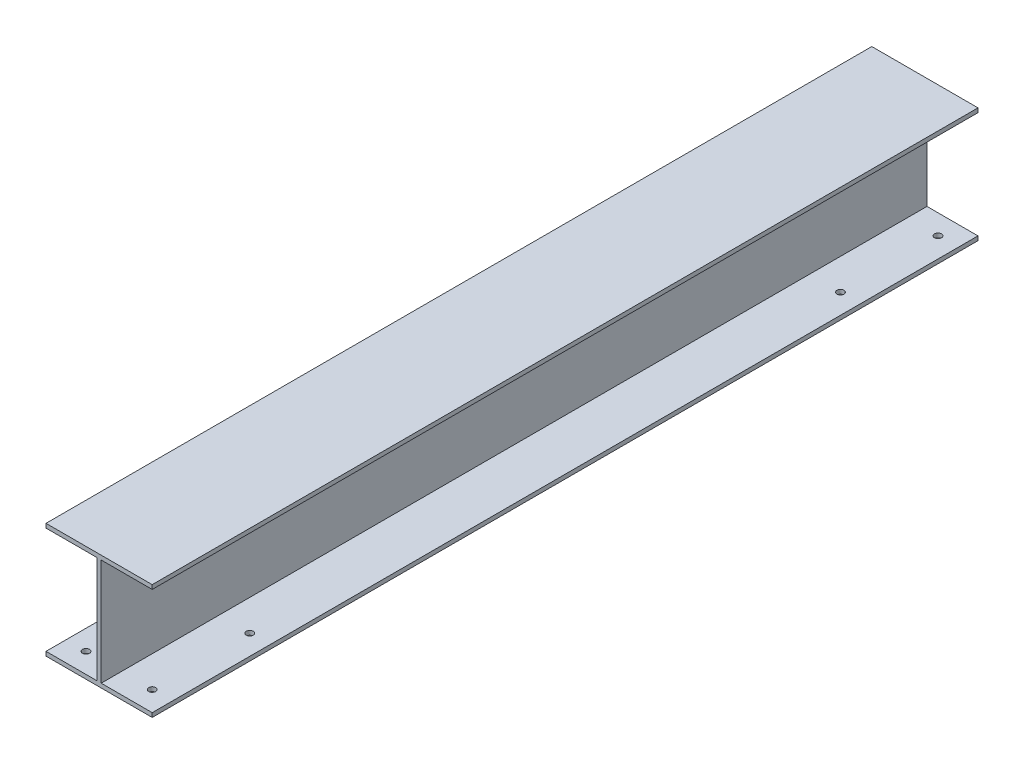
ISO-10303-21;
HEADER;
FILE_DESCRIPTION(('STEP AP214'),'2;1');
FILE_NAME('part.step','',(''),(''),'','','');
FILE_SCHEMA(('AUTOMOTIVE_DESIGN { 1 0 10303 214 1 1 1 1 }'));
ENDSEC;
DATA;
#1=APPLICATION_CONTEXT('core data for automotive mechanical design processes');
#2=APPLICATION_PROTOCOL_DEFINITION('international standard','automotive_design',2000,#1);
#3=PRODUCT_CONTEXT('',#1,'mechanical');
#4=PRODUCT('Part','Part','',(#3));
#5=PRODUCT_RELATED_PRODUCT_CATEGORY('part','',(#4));
#6=PRODUCT_DEFINITION_FORMATION('','',#4);
#7=PRODUCT_DEFINITION_CONTEXT('part definition',#1,'design');
#8=PRODUCT_DEFINITION('design','',#6,#7);
#9=PRODUCT_DEFINITION_SHAPE('','',#8);
#10=(LENGTH_UNIT() NAMED_UNIT(*) SI_UNIT(.MILLI.,.METRE.));
#11=(NAMED_UNIT(*) PLANE_ANGLE_UNIT() SI_UNIT($,.RADIAN.));
#12=(NAMED_UNIT(*) SI_UNIT($,.STERADIAN.) SOLID_ANGLE_UNIT());
#13=UNCERTAINTY_MEASURE_WITH_UNIT(LENGTH_MEASURE(1.E-05),#10,'distance_accuracy_value','');
#14=(GEOMETRIC_REPRESENTATION_CONTEXT(3) GLOBAL_UNCERTAINTY_ASSIGNED_CONTEXT((#13)) GLOBAL_UNIT_ASSIGNED_CONTEXT((#10,
#11,#12)) REPRESENTATION_CONTEXT('',''));
#15=CARTESIAN_POINT('',(0.,0.,0.));
#16=DIRECTION('',(0.,0.,1.));
#17=DIRECTION('',(1.,0.,0.));
#18=AXIS2_PLACEMENT_3D('',#15,#16,#17);
#19=CARTESIAN_POINT('',(0.,-76.55,1185.));
#20=DIRECTION('',(0.,1.,0.));
#21=DIRECTION('',(0.,0.,1.));
#22=AXIS2_PLACEMENT_3D('',#19,#20,#21);
#23=PLANE('',#22);
#24=CARTESIAN_POINT('',(47.4999999999999,-76.55,28.7000000000004));
#25=DIRECTION('',(0.,1.,0.));
#26=DIRECTION('',(0.,0.,1.));
#27=AXIS2_PLACEMENT_3D('',#24,#25,#26);
#28=CIRCLE('',#27,4.99999999999995);
#29=CARTESIAN_POINT('',(47.4999999999999,-76.55,33.7000000000003));
#30=VERTEX_POINT('',#29);
#31=EDGE_CURVE('E275',#30,#30,#28,.T.);
#32=ORIENTED_EDGE('',*,*,#31,.F.);
#33=EDGE_LOOP('',(#32));
#34=FACE_BOUND('',#33,.T.);
#35=CARTESIAN_POINT('',(47.4999999999999,-76.55,168.7));
#36=DIRECTION('',(0.,1.,0.));
#37=DIRECTION('',(0.,0.,1.));
#38=AXIS2_PLACEMENT_3D('',#35,#36,#37);
#39=CIRCLE('',#38,4.99999999999995);
#40=CARTESIAN_POINT('',(47.4999999999999,-76.55,173.7));
#41=VERTEX_POINT('',#40);
#42=EDGE_CURVE('E279',#41,#41,#39,.T.);
#43=ORIENTED_EDGE('',*,*,#42,.F.);
#44=EDGE_LOOP('',(#43));
#45=FACE_BOUND('',#44,.T.);
#46=CARTESIAN_POINT('',(47.5,-76.55,1016.3));
#47=DIRECTION('',(0.,1.,0.));
#48=DIRECTION('',(0.,0.,1.));
#49=AXIS2_PLACEMENT_3D('',#46,#47,#48);
#50=CIRCLE('',#49,5.);
#51=CARTESIAN_POINT('',(47.5,-76.55,1021.3));
#52=VERTEX_POINT('',#51);
#53=EDGE_CURVE('E283',#52,#52,#50,.T.);
#54=ORIENTED_EDGE('',*,*,#53,.F.);
#55=EDGE_LOOP('',(#54));
#56=FACE_BOUND('',#55,.T.);
#57=CARTESIAN_POINT('',(47.5,-76.55,1156.3));
#58=DIRECTION('',(0.,1.,0.));
#59=DIRECTION('',(0.,0.,1.));
#60=AXIS2_PLACEMENT_3D('',#57,#58,#59);
#61=CIRCLE('',#60,5.);
#62=CARTESIAN_POINT('',(47.5,-76.55,1161.3));
#63=VERTEX_POINT('',#62);
#64=EDGE_CURVE('E286',#63,#63,#61,.T.);
#65=ORIENTED_EDGE('',*,*,#64,.F.);
#66=EDGE_LOOP('',(#65));
#67=FACE_BOUND('',#66,.T.);
#68=DIRECTION('',(1.,0.,0.));
#69=VECTOR('',#68,1.);
#70=CARTESIAN_POINT('',(0.,-76.55,0.));
#71=LINE('',#70,#69);
#72=CARTESIAN_POINT('',(2.99999999999993,-76.55,0.));
#73=VERTEX_POINT('',#72);
#74=CARTESIAN_POINT('',(76.2,-76.55,0.));
#75=VERTEX_POINT('',#74);
#76=EDGE_CURVE('E150',#73,#75,#71,.T.);
#77=ORIENTED_EDGE('',*,*,#76,.F.);
#78=DIRECTION('',(0.,0.,-1.));
#79=VECTOR('',#78,1.);
#80=CARTESIAN_POINT('',(2.99999999999993,-76.55,1185.));
#81=LINE('',#80,#79);
#82=CARTESIAN_POINT('',(2.99999999999993,-76.55,1185.));
#83=VERTEX_POINT('',#82);
#84=EDGE_CURVE('E11',#83,#73,#81,.T.);
#85=ORIENTED_EDGE('',*,*,#84,.F.);
#86=DIRECTION('',(1.,0.,0.));
#87=VECTOR('',#86,1.);
#88=CARTESIAN_POINT('',(0.,-76.55,1185.));
#89=LINE('',#88,#87);
#90=CARTESIAN_POINT('',(76.2,-76.55,1185.));
#91=VERTEX_POINT('',#90);
#92=EDGE_CURVE('E180',#83,#91,#89,.T.);
#93=ORIENTED_EDGE('',*,*,#92,.T.);
#94=DIRECTION('',(0.,0.,-1.));
#95=VECTOR('',#94,1.);
#96=CARTESIAN_POINT('',(76.2,-76.55,1185.));
#97=LINE('',#96,#95);
#98=EDGE_CURVE('E98',#91,#75,#97,.T.);
#99=ORIENTED_EDGE('',*,*,#98,.T.);
#100=EDGE_LOOP('',(#77,#85,#93,#99));
#101=FACE_BOUND('',#100,.T.);
#102=ADVANCED_FACE('F35',(#34,#45,#56,#67,#101),#23,.T.);
#103=CARTESIAN_POINT('',(2.99999999999994,0.,1185.));
#104=DIRECTION('',(1.,0.,0.));
#105=DIRECTION('',(0.,1.,0.));
#106=AXIS2_PLACEMENT_3D('',#103,#104,#105);
#107=PLANE('',#106);
#108=DIRECTION('',(0.,-1.,0.));
#109=VECTOR('',#108,1.);
#110=CARTESIAN_POINT('',(2.99999999999994,0.,0.));
#111=LINE('',#110,#109);
#112=CARTESIAN_POINT('',(2.99999999999994,76.55,0.));
#113=VERTEX_POINT('',#112);
#114=EDGE_CURVE('E153',#113,#73,#111,.T.);
#115=ORIENTED_EDGE('',*,*,#114,.F.);
#116=DIRECTION('',(0.,0.,-1.));
#117=VECTOR('',#116,1.);
#118=CARTESIAN_POINT('',(2.99999999999994,76.55,1185.));
#119=LINE('',#118,#117);
#120=CARTESIAN_POINT('',(2.99999999999994,76.55,1185.));
#121=VERTEX_POINT('',#120);
#122=EDGE_CURVE('E43',#121,#113,#119,.T.);
#123=ORIENTED_EDGE('',*,*,#122,.F.);
#124=DIRECTION('',(0.,-1.,0.));
#125=VECTOR('',#124,1.);
#126=CARTESIAN_POINT('',(2.99999999999994,0.,1185.));
#127=LINE('',#126,#125);
#128=EDGE_CURVE('E211',#121,#83,#127,.T.);
#129=ORIENTED_EDGE('',*,*,#128,.T.);
#130=ORIENTED_EDGE('',*,*,#84,.T.);
#131=EDGE_LOOP('',(#115,#123,#129,#130));
#132=FACE_BOUND('',#131,.T.);
#133=ADVANCED_FACE('F210',(#132),#107,.T.);
#134=CARTESIAN_POINT('',(0.,76.55,1185.));
#135=DIRECTION('',(0.,1.,0.));
#136=DIRECTION('',(0.,0.,1.));
#137=AXIS2_PLACEMENT_3D('',#134,#135,#136);
#138=PLANE('',#137);
#139=DIRECTION('',(1.,0.,0.));
#140=VECTOR('',#139,1.);
#141=CARTESIAN_POINT('',(0.,76.55,0.));
#142=LINE('',#141,#140);
#143=CARTESIAN_POINT('',(76.2,76.55,0.));
#144=VERTEX_POINT('',#143);
#145=EDGE_CURVE('E157',#113,#144,#142,.T.);
#146=ORIENTED_EDGE('',*,*,#145,.T.);
#147=DIRECTION('',(0.,0.,-1.));
#148=VECTOR('',#147,1.);
#149=CARTESIAN_POINT('',(76.2,76.55,1185.));
#150=LINE('',#149,#148);
#151=CARTESIAN_POINT('',(76.2,76.55,1185.));
#152=VERTEX_POINT('',#151);
#153=EDGE_CURVE('E196',#152,#144,#150,.T.);
#154=ORIENTED_EDGE('',*,*,#153,.F.);
#155=DIRECTION('',(1.,0.,0.));
#156=VECTOR('',#155,1.);
#157=CARTESIAN_POINT('',(0.,76.55,1185.));
#158=LINE('',#157,#156);
#159=EDGE_CURVE('E202',#121,#152,#158,.T.);
#160=ORIENTED_EDGE('',*,*,#159,.F.);
#161=ORIENTED_EDGE('',*,*,#122,.T.);
#162=EDGE_LOOP('',(#146,#154,#160,#161));
#163=FACE_BOUND('',#162,.T.);
#164=ADVANCED_FACE('F200',(#163),#138,.F.);
#165=CARTESIAN_POINT('',(76.2,0.,1185.));
#166=DIRECTION('',(1.,0.,0.));
#167=DIRECTION('',(0.,0.,-1.));
#168=AXIS2_PLACEMENT_3D('',#165,#166,#167);
#169=PLANE('',#168);
#170=DIRECTION('',(0.,-1.,0.));
#171=VECTOR('',#170,1.);
#172=CARTESIAN_POINT('',(76.2,0.,0.));
#173=LINE('',#172,#171);
#174=CARTESIAN_POINT('',(76.2,82.55,0.));
#175=VERTEX_POINT('',#174);
#176=EDGE_CURVE('E160',#175,#144,#173,.T.);
#177=ORIENTED_EDGE('',*,*,#176,.F.);
#178=DIRECTION('',(0.,0.,-1.));
#179=VECTOR('',#178,1.);
#180=CARTESIAN_POINT('',(76.2,82.55,1185.));
#181=LINE('',#180,#179);
#182=CARTESIAN_POINT('',(76.2,82.55,1185.));
#183=VERTEX_POINT('',#182);
#184=EDGE_CURVE('E194',#183,#175,#181,.T.);
#185=ORIENTED_EDGE('',*,*,#184,.F.);
#186=DIRECTION('',(0.,-1.,0.));
#187=VECTOR('',#186,1.);
#188=CARTESIAN_POINT('',(76.2,0.,1185.));
#189=LINE('',#188,#187);
#190=EDGE_CURVE('E221',#183,#152,#189,.T.);
#191=ORIENTED_EDGE('',*,*,#190,.T.);
#192=ORIENTED_EDGE('',*,*,#153,.T.);
#193=EDGE_LOOP('',(#177,#185,#191,#192));
#194=FACE_BOUND('',#193,.T.);
#195=ADVANCED_FACE('F256',(#194),#169,.T.);
#196=CARTESIAN_POINT('',(0.,82.55,1185.));
#197=DIRECTION('',(0.,1.,0.));
#198=DIRECTION('',(0.,0.,1.));
#199=AXIS2_PLACEMENT_3D('',#196,#197,#198);
#200=PLANE('',#199);
#201=DIRECTION('',(1.,0.,0.));
#202=VECTOR('',#201,1.);
#203=CARTESIAN_POINT('',(0.,82.55,0.));
#204=LINE('',#203,#202);
#205=CARTESIAN_POINT('',(-76.2,82.55,0.));
#206=VERTEX_POINT('',#205);
#207=EDGE_CURVE('E163',#206,#175,#204,.T.);
#208=ORIENTED_EDGE('',*,*,#207,.F.);
#209=DIRECTION('',(0.,0.,-1.));
#210=VECTOR('',#209,1.);
#211=CARTESIAN_POINT('',(-76.2,82.55,1185.));
#212=LINE('',#211,#210);
#213=CARTESIAN_POINT('',(-76.2,82.55,1185.));
#214=VERTEX_POINT('',#213);
#215=EDGE_CURVE('E192',#214,#206,#212,.T.);
#216=ORIENTED_EDGE('',*,*,#215,.F.);
#217=DIRECTION('',(1.,0.,0.));
#218=VECTOR('',#217,1.);
#219=CARTESIAN_POINT('',(0.,82.55,1185.));
#220=LINE('',#219,#218);
#221=EDGE_CURVE('E224',#214,#183,#220,.T.);
#222=ORIENTED_EDGE('',*,*,#221,.T.);
#223=ORIENTED_EDGE('',*,*,#184,.T.);
#224=EDGE_LOOP('',(#208,#216,#222,#223));
#225=FACE_BOUND('',#224,.T.);
#226=ADVANCED_FACE('F253',(#225),#200,.T.);
#227=CARTESIAN_POINT('',(-76.2,0.,1185.));
#228=DIRECTION('',(1.,0.,0.));
#229=DIRECTION('',(0.,0.,-1.));
#230=AXIS2_PLACEMENT_3D('',#227,#228,#229);
#231=PLANE('',#230);
#232=DIRECTION('',(0.,-1.,0.));
#233=VECTOR('',#232,1.);
#234=CARTESIAN_POINT('',(-76.2,0.,0.));
#235=LINE('',#234,#233);
#236=CARTESIAN_POINT('',(-76.2,76.55,0.));
#237=VERTEX_POINT('',#236);
#238=EDGE_CURVE('E166',#206,#237,#235,.T.);
#239=ORIENTED_EDGE('',*,*,#238,.T.);
#240=DIRECTION('',(0.,0.,-1.));
#241=VECTOR('',#240,1.);
#242=CARTESIAN_POINT('',(-76.2,76.55,1185.));
#243=LINE('',#242,#241);
#244=CARTESIAN_POINT('',(-76.2,76.55,1185.));
#245=VERTEX_POINT('',#244);
#246=EDGE_CURVE('E189',#245,#237,#243,.T.);
#247=ORIENTED_EDGE('',*,*,#246,.F.);
#248=DIRECTION('',(0.,-1.,0.));
#249=VECTOR('',#248,1.);
#250=CARTESIAN_POINT('',(-76.2,0.,1185.));
#251=LINE('',#250,#249);
#252=EDGE_CURVE('E227',#214,#245,#251,.T.);
#253=ORIENTED_EDGE('',*,*,#252,.F.);
#254=ORIENTED_EDGE('',*,*,#215,.T.);
#255=EDGE_LOOP('',(#239,#247,#253,#254));
#256=FACE_BOUND('',#255,.T.);
#257=ADVANCED_FACE('F249',(#256),#231,.F.);
#258=CARTESIAN_POINT('',(0.,76.55,1185.));
#259=DIRECTION('',(0.,1.,0.));
#260=DIRECTION('',(0.,0.,1.));
#261=AXIS2_PLACEMENT_3D('',#258,#259,#260);
#262=PLANE('',#261);
#263=DIRECTION('',(1.,0.,0.));
#264=VECTOR('',#263,1.);
#265=CARTESIAN_POINT('',(0.,76.55,0.));
#266=LINE('',#265,#264);
#267=CARTESIAN_POINT('',(-3.00000000000006,76.55,0.));
#268=VERTEX_POINT('',#267);
#269=EDGE_CURVE('E168',#237,#268,#266,.T.);
#270=ORIENTED_EDGE('',*,*,#269,.T.);
#271=DIRECTION('',(0.,0.,-1.));
#272=VECTOR('',#271,1.);
#273=CARTESIAN_POINT('',(-3.00000000000006,76.55,1185.));
#274=LINE('',#273,#272);
#275=CARTESIAN_POINT('',(-3.00000000000006,76.55,1185.));
#276=VERTEX_POINT('',#275);
#277=EDGE_CURVE('E186',#276,#268,#274,.T.);
#278=ORIENTED_EDGE('',*,*,#277,.F.);
#279=DIRECTION('',(1.,0.,0.));
#280=VECTOR('',#279,1.);
#281=CARTESIAN_POINT('',(0.,76.55,1185.));
#282=LINE('',#281,#280);
#283=EDGE_CURVE('E229',#245,#276,#282,.T.);
#284=ORIENTED_EDGE('',*,*,#283,.F.);
#285=ORIENTED_EDGE('',*,*,#246,.T.);
#286=EDGE_LOOP('',(#270,#278,#284,#285));
#287=FACE_BOUND('',#286,.T.);
#288=ADVANCED_FACE('F245',(#287),#262,.F.);
#289=CARTESIAN_POINT('',(-3.00000000000006,0.,1185.));
#290=DIRECTION('',(1.,0.,0.));
#291=DIRECTION('',(0.,1.,0.));
#292=AXIS2_PLACEMENT_3D('',#289,#290,#291);
#293=PLANE('',#292);
#294=DIRECTION('',(0.,-1.,0.));
#295=VECTOR('',#294,1.);
#296=CARTESIAN_POINT('',(-3.00000000000006,0.,0.));
#297=LINE('',#296,#295);
#298=CARTESIAN_POINT('',(-3.00000000000006,-76.55,0.));
#299=VERTEX_POINT('',#298);
#300=EDGE_CURVE('E170',#268,#299,#297,.T.);
#301=ORIENTED_EDGE('',*,*,#300,.T.);
#302=DIRECTION('',(0.,0.,-1.));
#303=VECTOR('',#302,1.);
#304=CARTESIAN_POINT('',(-3.00000000000006,-76.55,1185.));
#305=LINE('',#304,#303);
#306=CARTESIAN_POINT('',(-3.00000000000006,-76.55,1185.));
#307=VERTEX_POINT('',#306);
#308=EDGE_CURVE('E184',#307,#299,#305,.T.);
#309=ORIENTED_EDGE('',*,*,#308,.F.);
#310=DIRECTION('',(0.,-1.,0.));
#311=VECTOR('',#310,1.);
#312=CARTESIAN_POINT('',(-3.00000000000006,0.,1185.));
#313=LINE('',#312,#311);
#314=EDGE_CURVE('E231',#276,#307,#313,.T.);
#315=ORIENTED_EDGE('',*,*,#314,.F.);
#316=ORIENTED_EDGE('',*,*,#277,.T.);
#317=EDGE_LOOP('',(#301,#309,#315,#316));
#318=FACE_BOUND('',#317,.T.);
#319=ADVANCED_FACE('F240',(#318),#293,.F.);
#320=CARTESIAN_POINT('',(0.,-76.55,1185.));
#321=DIRECTION('',(0.,1.,0.));
#322=DIRECTION('',(0.,0.,1.));
#323=AXIS2_PLACEMENT_3D('',#320,#321,#322);
#324=PLANE('',#323);
#325=CARTESIAN_POINT('',(-47.5000000000001,-76.55,28.7000000000004));
#326=DIRECTION('',(0.,1.,0.));
#327=DIRECTION('',(0.,0.,1.));
#328=AXIS2_PLACEMENT_3D('',#325,#326,#327);
#329=CIRCLE('',#328,4.99999999999999);
#330=CARTESIAN_POINT('',(-47.5000000000001,-76.55,33.7000000000004));
#331=VERTEX_POINT('',#330);
#332=EDGE_CURVE('E319',#331,#331,#329,.T.);
#333=ORIENTED_EDGE('',*,*,#332,.F.);
#334=EDGE_LOOP('',(#333));
#335=FACE_BOUND('',#334,.T.);
#336=CARTESIAN_POINT('',(-47.5000000000001,-76.55,168.7));
#337=DIRECTION('',(0.,1.,0.));
#338=DIRECTION('',(0.,0.,1.));
#339=AXIS2_PLACEMENT_3D('',#336,#337,#338);
#340=CIRCLE('',#339,4.99999999999999);
#341=CARTESIAN_POINT('',(-47.5000000000001,-76.55,173.7));
#342=VERTEX_POINT('',#341);
#343=EDGE_CURVE('E309',#342,#342,#340,.T.);
#344=ORIENTED_EDGE('',*,*,#343,.F.);
#345=EDGE_LOOP('',(#344));
#346=FACE_BOUND('',#345,.T.);
#347=CARTESIAN_POINT('',(-47.5000000000001,-76.55,1016.3));
#348=DIRECTION('',(0.,1.,0.));
#349=DIRECTION('',(0.,0.,1.));
#350=AXIS2_PLACEMENT_3D('',#347,#348,#349);
#351=CIRCLE('',#350,5.);
#352=CARTESIAN_POINT('',(-47.5000000000001,-76.55,1021.3));
#353=VERTEX_POINT('',#352);
#354=EDGE_CURVE('E293',#353,#353,#351,.T.);
#355=ORIENTED_EDGE('',*,*,#354,.F.);
#356=EDGE_LOOP('',(#355));
#357=FACE_BOUND('',#356,.T.);
#358=CARTESIAN_POINT('',(-47.5000000000001,-76.55,1156.3));
#359=DIRECTION('',(0.,1.,0.));
#360=DIRECTION('',(0.,0.,1.));
#361=AXIS2_PLACEMENT_3D('',#358,#359,#360);
#362=CIRCLE('',#361,5.);
#363=CARTESIAN_POINT('',(-47.5000000000001,-76.55,1161.3));
#364=VERTEX_POINT('',#363);
#365=EDGE_CURVE('E154',#364,#364,#362,.T.);
#366=ORIENTED_EDGE('',*,*,#365,.F.);
#367=EDGE_LOOP('',(#366));
#368=FACE_BOUND('',#367,.T.);
#369=DIRECTION('',(1.,0.,0.));
#370=VECTOR('',#369,1.);
#371=CARTESIAN_POINT('',(0.,-76.55,0.));
#372=LINE('',#371,#370);
#373=CARTESIAN_POINT('',(-76.2,-76.55,0.));
#374=VERTEX_POINT('',#373);
#375=EDGE_CURVE('E173',#374,#299,#372,.T.);
#376=ORIENTED_EDGE('',*,*,#375,.F.);
#377=DIRECTION('',(0.,0.,-1.));
#378=VECTOR('',#377,1.);
#379=CARTESIAN_POINT('',(-76.2,-76.55,1185.));
#380=LINE('',#379,#378);
#381=CARTESIAN_POINT('',(-76.2,-76.55,1185.));
#382=VERTEX_POINT('',#381);
#383=EDGE_CURVE('E142',#382,#374,#380,.T.);
#384=ORIENTED_EDGE('',*,*,#383,.F.);
#385=DIRECTION('',(1.,0.,0.));
#386=VECTOR('',#385,1.);
#387=CARTESIAN_POINT('',(0.,-76.55,1185.));
#388=LINE('',#387,#386);
#389=EDGE_CURVE('E135',#382,#307,#388,.T.);
#390=ORIENTED_EDGE('',*,*,#389,.T.);
#391=ORIENTED_EDGE('',*,*,#308,.T.);
#392=EDGE_LOOP('',(#376,#384,#390,#391));
#393=FACE_BOUND('',#392,.T.);
#394=ADVANCED_FACE('F234',(#335,#346,#357,#368,#393),#324,.T.);
#395=CARTESIAN_POINT('',(-76.2,0.,1185.));
#396=DIRECTION('',(1.,0.,0.));
#397=DIRECTION('',(0.,0.,-1.));
#398=AXIS2_PLACEMENT_3D('',#395,#396,#397);
#399=PLANE('',#398);
#400=DIRECTION('',(0.,-1.,0.));
#401=VECTOR('',#400,1.);
#402=CARTESIAN_POINT('',(-76.2,0.,0.));
#403=LINE('',#402,#401);
#404=CARTESIAN_POINT('',(-76.2,-82.55,0.));
#405=VERTEX_POINT('',#404);
#406=EDGE_CURVE('E141',#374,#405,#403,.T.);
#407=ORIENTED_EDGE('',*,*,#406,.T.);
#408=DIRECTION('',(0.,0.,-1.));
#409=VECTOR('',#408,1.);
#410=CARTESIAN_POINT('',(-76.2,-82.55,1185.));
#411=LINE('',#410,#409);
#412=CARTESIAN_POINT('',(-76.2,-82.55,1185.));
#413=VERTEX_POINT('',#412);
#414=EDGE_CURVE('E138',#413,#405,#411,.T.);
#415=ORIENTED_EDGE('',*,*,#414,.F.);
#416=DIRECTION('',(0.,-1.,0.));
#417=VECTOR('',#416,1.);
#418=CARTESIAN_POINT('',(-76.2,0.,1185.));
#419=LINE('',#418,#417);
#420=EDGE_CURVE('E129',#382,#413,#419,.T.);
#421=ORIENTED_EDGE('',*,*,#420,.F.);
#422=ORIENTED_EDGE('',*,*,#383,.T.);
#423=EDGE_LOOP('',(#407,#415,#421,#422));
#424=FACE_BOUND('',#423,.T.);
#425=ADVANCED_FACE('F139',(#424),#399,.F.);
#426=CARTESIAN_POINT('',(0.,-82.55,1185.));
#427=DIRECTION('',(0.,1.,0.));
#428=DIRECTION('',(0.,0.,1.));
#429=AXIS2_PLACEMENT_3D('',#426,#427,#428);
#430=PLANE('',#429);
#431=CARTESIAN_POINT('',(-47.5000000000001,-82.55,28.7000000000004));
#432=DIRECTION('',(0.,-1.,0.));
#433=DIRECTION('',(0.,0.,1.));
#434=AXIS2_PLACEMENT_3D('',#431,#432,#433);
#435=CIRCLE('',#434,4.99999999999999);
#436=CARTESIAN_POINT('',(-47.5000000000001,-82.55,33.7000000000004));
#437=VERTEX_POINT('',#436);
#438=EDGE_CURVE('E322',#437,#437,#435,.T.);
#439=ORIENTED_EDGE('',*,*,#438,.F.);
#440=EDGE_LOOP('',(#439));
#441=FACE_BOUND('',#440,.T.);
#442=CARTESIAN_POINT('',(47.4999999999999,-82.55,28.7000000000004));
#443=DIRECTION('',(0.,-1.,0.));
#444=DIRECTION('',(0.,0.,1.));
#445=AXIS2_PLACEMENT_3D('',#442,#443,#444);
#446=CIRCLE('',#445,4.99999999999995);
#447=CARTESIAN_POINT('',(47.4999999999999,-82.55,33.7000000000003));
#448=VERTEX_POINT('',#447);
#449=EDGE_CURVE('E316',#448,#448,#446,.T.);
#450=ORIENTED_EDGE('',*,*,#449,.F.);
#451=EDGE_LOOP('',(#450));
#452=FACE_BOUND('',#451,.T.);
#453=CARTESIAN_POINT('',(-47.5000000000001,-82.55,168.7));
#454=DIRECTION('',(0.,-1.,0.));
#455=DIRECTION('',(0.,0.,1.));
#456=AXIS2_PLACEMENT_3D('',#453,#454,#455);
#457=CIRCLE('',#456,4.99999999999999);
#458=CARTESIAN_POINT('',(-47.5000000000001,-82.55,173.7));
#459=VERTEX_POINT('',#458);
#460=EDGE_CURVE('E312',#459,#459,#457,.T.);
#461=ORIENTED_EDGE('',*,*,#460,.F.);
#462=EDGE_LOOP('',(#461));
#463=FACE_BOUND('',#462,.T.);
#464=CARTESIAN_POINT('',(47.4999999999999,-82.55,168.7));
#465=DIRECTION('',(0.,-1.,0.));
#466=DIRECTION('',(0.,0.,1.));
#467=AXIS2_PLACEMENT_3D('',#464,#465,#466);
#468=CIRCLE('',#467,4.99999999999995);
#469=CARTESIAN_POINT('',(47.4999999999999,-82.55,173.7));
#470=VERTEX_POINT('',#469);
#471=EDGE_CURVE('E306',#470,#470,#468,.T.);
#472=ORIENTED_EDGE('',*,*,#471,.F.);
#473=EDGE_LOOP('',(#472));
#474=FACE_BOUND('',#473,.T.);
#475=CARTESIAN_POINT('',(47.5,-82.55,1016.3));
#476=DIRECTION('',(0.,-1.,0.));
#477=DIRECTION('',(0.,0.,-1.));
#478=AXIS2_PLACEMENT_3D('',#475,#476,#477);
#479=CIRCLE('',#478,5.);
#480=CARTESIAN_POINT('',(47.5,-82.55,1011.3));
#481=VERTEX_POINT('',#480);
#482=EDGE_CURVE('E302',#481,#481,#479,.T.);
#483=ORIENTED_EDGE('',*,*,#482,.F.);
#484=EDGE_LOOP('',(#483));
#485=FACE_BOUND('',#484,.T.);
#486=CARTESIAN_POINT('',(-47.5000000000001,-82.55,1016.3));
#487=DIRECTION('',(0.,-1.,0.));
#488=DIRECTION('',(0.,0.,-1.));
#489=AXIS2_PLACEMENT_3D('',#486,#487,#488);
#490=CIRCLE('',#489,5.);
#491=CARTESIAN_POINT('',(-47.5000000000001,-82.55,1011.3));
#492=VERTEX_POINT('',#491);
#493=EDGE_CURVE('E298',#492,#492,#490,.T.);
#494=ORIENTED_EDGE('',*,*,#493,.F.);
#495=EDGE_LOOP('',(#494));
#496=FACE_BOUND('',#495,.T.);
#497=CARTESIAN_POINT('',(47.5,-82.55,1156.3));
#498=DIRECTION('',(0.,-1.,0.));
#499=DIRECTION('',(0.,0.,-1.));
#500=AXIS2_PLACEMENT_3D('',#497,#498,#499);
#501=CIRCLE('',#500,5.);
#502=CARTESIAN_POINT('',(47.5,-82.55,1151.3));
#503=VERTEX_POINT('',#502);
#504=EDGE_CURVE('E289',#503,#503,#501,.T.);
#505=ORIENTED_EDGE('',*,*,#504,.F.);
#506=EDGE_LOOP('',(#505));
#507=FACE_BOUND('',#506,.T.);
#508=CARTESIAN_POINT('',(-47.5000000000001,-82.55,1156.3));
#509=DIRECTION('',(0.,-1.,0.));
#510=DIRECTION('',(0.,0.,-1.));
#511=AXIS2_PLACEMENT_3D('',#508,#509,#510);
#512=CIRCLE('',#511,5.);
#513=CARTESIAN_POINT('',(-47.5000000000001,-82.55,1151.3));
#514=VERTEX_POINT('',#513);
#515=EDGE_CURVE('E288',#514,#514,#512,.T.);
#516=ORIENTED_EDGE('',*,*,#515,.F.);
#517=EDGE_LOOP('',(#516));
#518=FACE_BOUND('',#517,.T.);
#519=DIRECTION('',(1.,0.,0.));
#520=VECTOR('',#519,1.);
#521=CARTESIAN_POINT('',(0.,-82.55,0.));
#522=LINE('',#521,#520);
#523=CARTESIAN_POINT('',(76.2,-82.55,0.));
#524=VERTEX_POINT('',#523);
#525=EDGE_CURVE('E91',#405,#524,#522,.T.);
#526=ORIENTED_EDGE('',*,*,#525,.T.);
#527=DIRECTION('',(0.,0.,-1.));
#528=VECTOR('',#527,1.);
#529=CARTESIAN_POINT('',(76.2,-82.55,1185.));
#530=LINE('',#529,#528);
#531=CARTESIAN_POINT('',(76.2,-82.55,1185.));
#532=VERTEX_POINT('',#531);
#533=EDGE_CURVE('E143',#532,#524,#530,.T.);
#534=ORIENTED_EDGE('',*,*,#533,.F.);
#535=DIRECTION('',(1.,0.,0.));
#536=VECTOR('',#535,1.);
#537=CARTESIAN_POINT('',(0.,-82.55,1185.));
#538=LINE('',#537,#536);
#539=EDGE_CURVE('E133',#413,#532,#538,.T.);
#540=ORIENTED_EDGE('',*,*,#539,.F.);
#541=ORIENTED_EDGE('',*,*,#414,.T.);
#542=EDGE_LOOP('',(#526,#534,#540,#541));
#543=FACE_BOUND('',#542,.T.);
#544=ADVANCED_FACE('F145',(#441,#452,#463,#474,#485,#496,#507,#518,#543),#430,.F.);
#545=CARTESIAN_POINT('',(76.2,0.,1185.));
#546=DIRECTION('',(-1.,0.,0.));
#547=DIRECTION('',(0.,0.,1.));
#548=AXIS2_PLACEMENT_3D('',#545,#546,#547);
#549=PLANE('',#548);
#550=DIRECTION('',(0.,1.,0.));
#551=VECTOR('',#550,1.);
#552=CARTESIAN_POINT('',(76.2,0.,0.));
#553=LINE('',#552,#551);
#554=EDGE_CURVE('E178',#524,#75,#553,.T.);
#555=ORIENTED_EDGE('',*,*,#554,.T.);
#556=ORIENTED_EDGE('',*,*,#98,.F.);
#557=DIRECTION('',(0.,1.,0.));
#558=VECTOR('',#557,1.);
#559=CARTESIAN_POINT('',(76.2,0.,1185.));
#560=LINE('',#559,#558);
#561=EDGE_CURVE('E51',#532,#91,#560,.T.);
#562=ORIENTED_EDGE('',*,*,#561,.F.);
#563=ORIENTED_EDGE('',*,*,#533,.T.);
#564=EDGE_LOOP('',(#555,#556,#562,#563));
#565=FACE_BOUND('',#564,.T.);
#566=ADVANCED_FACE('F214',(#565),#549,.F.);
#567=CARTESIAN_POINT('',(0.,0.,1185.));
#568=DIRECTION('',(0.,0.,1.));
#569=DIRECTION('',(1.,0.,0.));
#570=AXIS2_PLACEMENT_3D('',#567,#568,#569);
#571=PLANE('',#570);
#572=ORIENTED_EDGE('',*,*,#92,.F.);
#573=ORIENTED_EDGE('',*,*,#128,.F.);
#574=ORIENTED_EDGE('',*,*,#159,.T.);
#575=ORIENTED_EDGE('',*,*,#190,.F.);
#576=ORIENTED_EDGE('',*,*,#221,.F.);
#577=ORIENTED_EDGE('',*,*,#252,.T.);
#578=ORIENTED_EDGE('',*,*,#283,.T.);
#579=ORIENTED_EDGE('',*,*,#314,.T.);
#580=ORIENTED_EDGE('',*,*,#389,.F.);
#581=ORIENTED_EDGE('',*,*,#420,.T.);
#582=ORIENTED_EDGE('',*,*,#539,.T.);
#583=ORIENTED_EDGE('',*,*,#561,.T.);
#584=EDGE_LOOP('',(#572,#573,#574,#575,#576,#577,#578,#579,#580,#581,#582,#583));
#585=FACE_BOUND('',#584,.T.);
#586=ADVANCED_FACE('F131',(#585),#571,.T.);
#587=CARTESIAN_POINT('',(0.,0.,0.));
#588=DIRECTION('',(0.,0.,1.));
#589=DIRECTION('',(1.,0.,0.));
#590=AXIS2_PLACEMENT_3D('',#587,#588,#589);
#591=PLANE('',#590);
#592=ORIENTED_EDGE('',*,*,#76,.T.);
#593=ORIENTED_EDGE('',*,*,#554,.F.);
#594=ORIENTED_EDGE('',*,*,#525,.F.);
#595=ORIENTED_EDGE('',*,*,#406,.F.);
#596=ORIENTED_EDGE('',*,*,#375,.T.);
#597=ORIENTED_EDGE('',*,*,#300,.F.);
#598=ORIENTED_EDGE('',*,*,#269,.F.);
#599=ORIENTED_EDGE('',*,*,#238,.F.);
#600=ORIENTED_EDGE('',*,*,#207,.T.);
#601=ORIENTED_EDGE('',*,*,#176,.T.);
#602=ORIENTED_EDGE('',*,*,#145,.F.);
#603=ORIENTED_EDGE('',*,*,#114,.T.);
#604=EDGE_LOOP('',(#592,#593,#594,#595,#596,#597,#598,#599,#600,#601,#602,#603));
#605=FACE_BOUND('',#604,.T.);
#606=ADVANCED_FACE('F208',(#605),#591,.F.);
#607=CARTESIAN_POINT('',(-47.5000000000001,-62.55,1156.3));
#608=DIRECTION('',(0.,-1.,0.));
#609=DIRECTION('',(0.,0.,-1.));
#610=AXIS2_PLACEMENT_3D('',#607,#608,#609);
#611=CYLINDRICAL_SURFACE('',#610,5.);
#612=ORIENTED_EDGE('',*,*,#365,.T.);
#613=EDGE_LOOP('',(#612));
#614=FACE_BOUND('',#613,.T.);
#615=ORIENTED_EDGE('',*,*,#515,.T.);
#616=EDGE_LOOP('',(#615));
#617=FACE_BOUND('',#616,.T.);
#618=ADVANCED_FACE('F345',(#614,#617),#611,.F.);
#619=CARTESIAN_POINT('',(47.5,-62.55,1156.3));
#620=DIRECTION('',(0.,-1.,0.));
#621=DIRECTION('',(0.,0.,-1.));
#622=AXIS2_PLACEMENT_3D('',#619,#620,#621);
#623=CYLINDRICAL_SURFACE('',#622,5.);
#624=ORIENTED_EDGE('',*,*,#64,.T.);
#625=EDGE_LOOP('',(#624));
#626=FACE_BOUND('',#625,.T.);
#627=ORIENTED_EDGE('',*,*,#504,.T.);
#628=EDGE_LOOP('',(#627));
#629=FACE_BOUND('',#628,.T.);
#630=ADVANCED_FACE('F347',(#626,#629),#623,.F.);
#631=CARTESIAN_POINT('',(-47.5000000000001,-62.55,1016.3));
#632=DIRECTION('',(0.,-1.,0.));
#633=DIRECTION('',(0.,0.,-1.));
#634=AXIS2_PLACEMENT_3D('',#631,#632,#633);
#635=CYLINDRICAL_SURFACE('',#634,5.);
#636=ORIENTED_EDGE('',*,*,#354,.T.);
#637=EDGE_LOOP('',(#636));
#638=FACE_BOUND('',#637,.T.);
#639=ORIENTED_EDGE('',*,*,#493,.T.);
#640=EDGE_LOOP('',(#639));
#641=FACE_BOUND('',#640,.T.);
#642=ADVANCED_FACE('F354',(#638,#641),#635,.F.);
#643=CARTESIAN_POINT('',(47.5,-62.55,1016.3));
#644=DIRECTION('',(0.,-1.,0.));
#645=DIRECTION('',(0.,0.,-1.));
#646=AXIS2_PLACEMENT_3D('',#643,#644,#645);
#647=CYLINDRICAL_SURFACE('',#646,5.);
#648=ORIENTED_EDGE('',*,*,#53,.T.);
#649=EDGE_LOOP('',(#648));
#650=FACE_BOUND('',#649,.T.);
#651=ORIENTED_EDGE('',*,*,#482,.T.);
#652=EDGE_LOOP('',(#651));
#653=FACE_BOUND('',#652,.T.);
#654=ADVANCED_FACE('F433',(#650,#653),#647,.F.);
#655=CARTESIAN_POINT('',(47.4999999999999,-62.55,168.7));
#656=DIRECTION('',(0.,-1.,0.));
#657=DIRECTION('',(0.,0.,-1.));
#658=AXIS2_PLACEMENT_3D('',#655,#656,#657);
#659=CYLINDRICAL_SURFACE('',#658,4.99999999999995);
#660=ORIENTED_EDGE('',*,*,#42,.T.);
#661=EDGE_LOOP('',(#660));
#662=FACE_BOUND('',#661,.T.);
#663=ORIENTED_EDGE('',*,*,#471,.T.);
#664=EDGE_LOOP('',(#663));
#665=FACE_BOUND('',#664,.T.);
#666=ADVANCED_FACE('F441',(#662,#665),#659,.F.);
#667=CARTESIAN_POINT('',(-47.5000000000001,-62.55,168.7));
#668=DIRECTION('',(0.,-1.,0.));
#669=DIRECTION('',(0.,0.,-1.));
#670=AXIS2_PLACEMENT_3D('',#667,#668,#669);
#671=CYLINDRICAL_SURFACE('',#670,4.99999999999999);
#672=ORIENTED_EDGE('',*,*,#343,.T.);
#673=EDGE_LOOP('',(#672));
#674=FACE_BOUND('',#673,.T.);
#675=ORIENTED_EDGE('',*,*,#460,.T.);
#676=EDGE_LOOP('',(#675));
#677=FACE_BOUND('',#676,.T.);
#678=ADVANCED_FACE('F450',(#674,#677),#671,.F.);
#679=CARTESIAN_POINT('',(47.4999999999999,-62.55,28.7000000000004));
#680=DIRECTION('',(0.,-1.,0.));
#681=DIRECTION('',(0.,0.,-1.));
#682=AXIS2_PLACEMENT_3D('',#679,#680,#681);
#683=CYLINDRICAL_SURFACE('',#682,4.99999999999995);
#684=ORIENTED_EDGE('',*,*,#31,.T.);
#685=EDGE_LOOP('',(#684));
#686=FACE_BOUND('',#685,.T.);
#687=ORIENTED_EDGE('',*,*,#449,.T.);
#688=EDGE_LOOP('',(#687));
#689=FACE_BOUND('',#688,.T.);
#690=ADVANCED_FACE('F459',(#686,#689),#683,.F.);
#691=CARTESIAN_POINT('',(-47.5000000000001,-62.55,28.7000000000004));
#692=DIRECTION('',(0.,-1.,0.));
#693=DIRECTION('',(0.,0.,-1.));
#694=AXIS2_PLACEMENT_3D('',#691,#692,#693);
#695=CYLINDRICAL_SURFACE('',#694,4.99999999999999);
#696=ORIENTED_EDGE('',*,*,#332,.T.);
#697=EDGE_LOOP('',(#696));
#698=FACE_BOUND('',#697,.T.);
#699=ORIENTED_EDGE('',*,*,#438,.T.);
#700=EDGE_LOOP('',(#699));
#701=FACE_BOUND('',#700,.T.);
#702=ADVANCED_FACE('F326',(#698,#701),#695,.F.);
#703=CLOSED_SHELL('',(#102,#133,#164,#195,#226,#257,#288,#319,#394,#425,#544,#566,#586,#606,
#618,#630,#642,#654,#666,#678,#690,#702));
#704=MANIFOLD_SOLID_BREP('B2',#703);
#705=ADVANCED_BREP_SHAPE_REPRESENTATION('',(#18,#704),#14);
#706=SHAPE_DEFINITION_REPRESENTATION(#9,#705);
ENDSEC;
END-ISO-10303-21;
